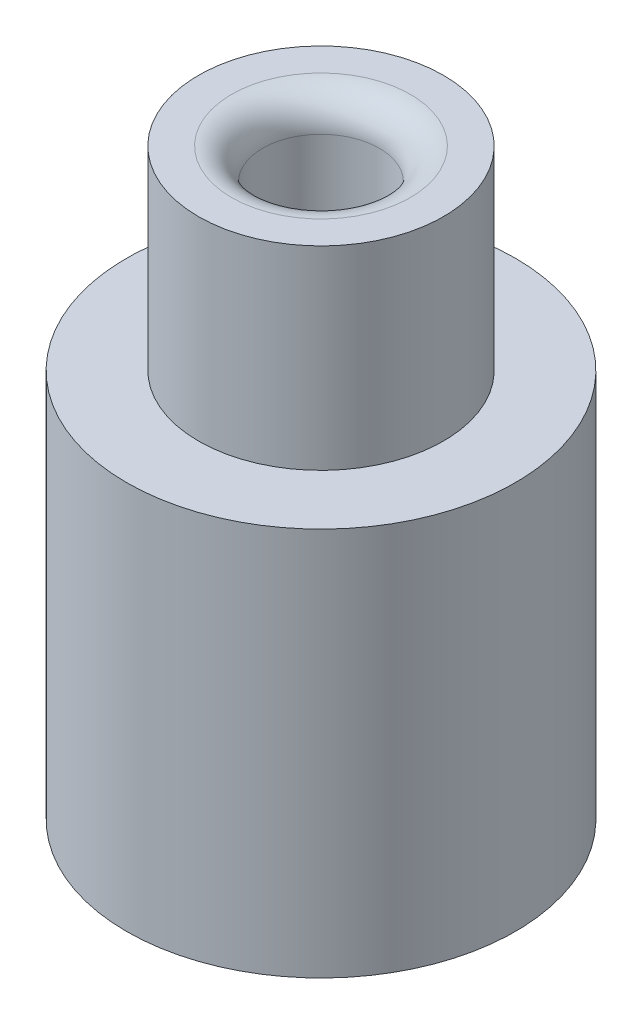
ISO-10303-21;
HEADER;
FILE_DESCRIPTION(('STEP AP214'),'2;1');
FILE_NAME('part.step','',(''),(''),'','','');
FILE_SCHEMA(('AUTOMOTIVE_DESIGN { 1 0 10303 214 1 1 1 1 }'));
ENDSEC;
DATA;
#1=APPLICATION_CONTEXT('core data for automotive mechanical design processes');
#2=APPLICATION_PROTOCOL_DEFINITION('international standard','automotive_design',2000,#1);
#3=PRODUCT_CONTEXT('',#1,'mechanical');
#4=PRODUCT('Part','Part','',(#3));
#5=PRODUCT_RELATED_PRODUCT_CATEGORY('part','',(#4));
#6=PRODUCT_DEFINITION_FORMATION('','',#4);
#7=PRODUCT_DEFINITION_CONTEXT('part definition',#1,'design');
#8=PRODUCT_DEFINITION('design','',#6,#7);
#9=PRODUCT_DEFINITION_SHAPE('','',#8);
#10=(LENGTH_UNIT() NAMED_UNIT(*) SI_UNIT(.MILLI.,.METRE.));
#11=(NAMED_UNIT(*) PLANE_ANGLE_UNIT() SI_UNIT($,.RADIAN.));
#12=(NAMED_UNIT(*) SI_UNIT($,.STERADIAN.) SOLID_ANGLE_UNIT());
#13=UNCERTAINTY_MEASURE_WITH_UNIT(LENGTH_MEASURE(1.E-05),#10,'distance_accuracy_value','');
#14=(GEOMETRIC_REPRESENTATION_CONTEXT(3) GLOBAL_UNCERTAINTY_ASSIGNED_CONTEXT((#13)) GLOBAL_UNIT_ASSIGNED_CONTEXT((#10,
#11,#12)) REPRESENTATION_CONTEXT('',''));
#15=CARTESIAN_POINT('',(0.,0.,0.));
#16=DIRECTION('',(0.,0.,1.));
#17=DIRECTION('',(1.,0.,0.));
#18=AXIS2_PLACEMENT_3D('',#15,#16,#17);
#19=CARTESIAN_POINT('',(0.,-4.,0.));
#20=DIRECTION('',(0.,1.,0.));
#21=DIRECTION('',(0.,0.,1.));
#22=AXIS2_PLACEMENT_3D('',#19,#20,#21);
#23=CYLINDRICAL_SURFACE('',#22,5.);
#24=CARTESIAN_POINT('',(0.,-4.,0.));
#25=DIRECTION('',(0.,1.,0.));
#26=DIRECTION('',(0.,0.,1.));
#27=AXIS2_PLACEMENT_3D('',#24,#25,#26);
#28=CIRCLE('',#27,5.);
#29=CARTESIAN_POINT('',(0.,-4.,5.));
#30=VERTEX_POINT('',#29);
#31=EDGE_CURVE('E46',#30,#30,#28,.T.);
#32=ORIENTED_EDGE('',*,*,#31,.T.);
#33=EDGE_LOOP('',(#32));
#34=FACE_BOUND('',#33,.T.);
#35=CARTESIAN_POINT('',(0.,6.,0.));
#36=DIRECTION('',(0.,1.,0.));
#37=DIRECTION('',(0.,0.,1.));
#38=AXIS2_PLACEMENT_3D('',#35,#36,#37);
#39=CIRCLE('',#38,5.);
#40=CARTESIAN_POINT('',(0.,6.,5.));
#41=VERTEX_POINT('',#40);
#42=EDGE_CURVE('E51',#41,#41,#39,.T.);
#43=ORIENTED_EDGE('',*,*,#42,.F.);
#44=EDGE_LOOP('',(#43));
#45=FACE_BOUND('',#44,.T.);
#46=ADVANCED_FACE('F31',(#34,#45),#23,.T.);
#47=CARTESIAN_POINT('',(0.,-4.,0.));
#48=DIRECTION('',(0.,1.,0.));
#49=DIRECTION('',(0.,0.,1.));
#50=AXIS2_PLACEMENT_3D('',#47,#48,#49);
#51=PLANE('',#50);
#52=CARTESIAN_POINT('',(0.,-4.,0.));
#53=DIRECTION('',(0.,-1.,0.));
#54=DIRECTION('',(0.,0.,-1.));
#55=AXIS2_PLACEMENT_3D('',#52,#53,#54);
#56=CIRCLE('',#55,2.25);
#57=CARTESIAN_POINT('',(0.,-4.,-2.25));
#58=VERTEX_POINT('',#57);
#59=EDGE_CURVE('E61',#58,#58,#56,.T.);
#60=ORIENTED_EDGE('',*,*,#59,.F.);
#61=EDGE_LOOP('',(#60));
#62=FACE_BOUND('',#61,.T.);
#63=ORIENTED_EDGE('',*,*,#31,.F.);
#64=EDGE_LOOP('',(#63));
#65=FACE_BOUND('',#64,.T.);
#66=ADVANCED_FACE('F76',(#62,#65),#51,.F.);
#67=CARTESIAN_POINT('',(0.,6.,0.));
#68=DIRECTION('',(0.,1.,0.));
#69=DIRECTION('',(0.,0.,1.));
#70=AXIS2_PLACEMENT_3D('',#67,#68,#69);
#71=PLANE('',#70);
#72=CARTESIAN_POINT('',(0.,6.,0.));
#73=DIRECTION('',(0.,1.,0.));
#74=DIRECTION('',(0.,0.,1.));
#75=AXIS2_PLACEMENT_3D('',#72,#73,#74);
#76=CIRCLE('',#75,3.15);
#77=CARTESIAN_POINT('',(0.,6.,3.15));
#78=VERTEX_POINT('',#77);
#79=EDGE_CURVE('E42',#78,#78,#76,.T.);
#80=ORIENTED_EDGE('',*,*,#79,.F.);
#81=EDGE_LOOP('',(#80));
#82=FACE_BOUND('',#81,.T.);
#83=ORIENTED_EDGE('',*,*,#42,.T.);
#84=EDGE_LOOP('',(#83));
#85=FACE_BOUND('',#84,.T.);
#86=ADVANCED_FACE('F79',(#82,#85),#71,.T.);
#87=CARTESIAN_POINT('',(0.,5.,0.));
#88=DIRECTION('',(0.,1.,0.));
#89=DIRECTION('',(0.,0.,1.));
#90=AXIS2_PLACEMENT_3D('',#87,#88,#89);
#91=CYLINDRICAL_SURFACE('',#90,3.15);
#92=ORIENTED_EDGE('',*,*,#79,.T.);
#93=EDGE_LOOP('',(#92));
#94=FACE_BOUND('',#93,.T.);
#95=CARTESIAN_POINT('',(0.,11.,0.));
#96=DIRECTION('',(0.,1.,0.));
#97=DIRECTION('',(0.,0.,1.));
#98=AXIS2_PLACEMENT_3D('',#95,#96,#97);
#99=CIRCLE('',#98,3.15);
#100=CARTESIAN_POINT('',(0.,11.,3.15));
#101=VERTEX_POINT('',#100);
#102=EDGE_CURVE('E54',#101,#101,#99,.T.);
#103=ORIENTED_EDGE('',*,*,#102,.F.);
#104=EDGE_LOOP('',(#103));
#105=FACE_BOUND('',#104,.T.);
#106=ADVANCED_FACE('F88',(#94,#105),#91,.T.);
#107=CARTESIAN_POINT('',(0.,11.,0.));
#108=DIRECTION('',(0.,1.,0.));
#109=DIRECTION('',(0.,0.,1.));
#110=AXIS2_PLACEMENT_3D('',#107,#108,#109);
#111=PLANE('',#110);
#112=CARTESIAN_POINT('',(0.,11.,0.));
#113=DIRECTION('',(0.,1.,0.));
#114=DIRECTION('',(0.,0.,1.));
#115=AXIS2_PLACEMENT_3D('',#112,#113,#114);
#116=CIRCLE('',#115,2.3);
#117=CARTESIAN_POINT('',(0.,11.,2.3));
#118=VERTEX_POINT('',#117);
#119=EDGE_CURVE('E10',#118,#118,#116,.F.);
#120=ORIENTED_EDGE('',*,*,#119,.T.);
#121=EDGE_LOOP('',(#120));
#122=FACE_BOUND('',#121,.T.);
#123=ORIENTED_EDGE('',*,*,#102,.T.);
#124=EDGE_LOOP('',(#123));
#125=FACE_BOUND('',#124,.T.);
#126=ADVANCED_FACE('F94',(#122,#125),#111,.T.);
#127=CARTESIAN_POINT('',(0.,0.999999999999999,0.));
#128=DIRECTION('',(0.,1.,0.));
#129=DIRECTION('',(0.,0.,1.));
#130=AXIS2_PLACEMENT_3D('',#127,#128,#129);
#131=CYLINDRICAL_SURFACE('',#130,1.5);
#132=CARTESIAN_POINT('',(0.,10.2,0.));
#133=DIRECTION('',(0.,1.,0.));
#134=DIRECTION('',(0.,0.,1.));
#135=AXIS2_PLACEMENT_3D('',#132,#133,#134);
#136=CIRCLE('',#135,1.5);
#137=CARTESIAN_POINT('',(0.,10.2,1.5));
#138=VERTEX_POINT('',#137);
#139=EDGE_CURVE('E38',#138,#138,#136,.T.);
#140=ORIENTED_EDGE('',*,*,#139,.T.);
#141=EDGE_LOOP('',(#140));
#142=FACE_BOUND('',#141,.T.);
#143=CARTESIAN_POINT('',(0.,1.,0.));
#144=DIRECTION('',(0.,-1.,0.));
#145=DIRECTION('',(0.,0.,-1.));
#146=AXIS2_PLACEMENT_3D('',#143,#144,#145);
#147=CIRCLE('',#146,1.5);
#148=CARTESIAN_POINT('',(0.,1.,-1.5));
#149=VERTEX_POINT('',#148);
#150=EDGE_CURVE('E57',#149,#149,#147,.F.);
#151=ORIENTED_EDGE('',*,*,#150,.F.);
#152=EDGE_LOOP('',(#151));
#153=FACE_BOUND('',#152,.T.);
#154=ADVANCED_FACE('F101',(#142,#153),#131,.F.);
#155=CARTESIAN_POINT('',(0.,1.,0.));
#156=DIRECTION('',(0.,-1.,0.));
#157=DIRECTION('',(0.,0.,-1.));
#158=AXIS2_PLACEMENT_3D('',#155,#156,#157);
#159=PLANE('',#158);
#160=CARTESIAN_POINT('',(0.,1.,0.));
#161=DIRECTION('',(0.,-1.,0.));
#162=DIRECTION('',(0.,0.,-1.));
#163=AXIS2_PLACEMENT_3D('',#160,#161,#162);
#164=CIRCLE('',#163,2.25);
#165=CARTESIAN_POINT('',(0.,1.,-2.25));
#166=VERTEX_POINT('',#165);
#167=EDGE_CURVE('E60',#166,#166,#164,.T.);
#168=ORIENTED_EDGE('',*,*,#167,.T.);
#169=EDGE_LOOP('',(#168));
#170=FACE_BOUND('',#169,.T.);
#171=ORIENTED_EDGE('',*,*,#150,.T.);
#172=EDGE_LOOP('',(#171));
#173=FACE_BOUND('',#172,.T.);
#174=ADVANCED_FACE('F67',(#170,#173),#159,.T.);
#175=CARTESIAN_POINT('',(0.,1.,0.));
#176=DIRECTION('',(0.,-1.,0.));
#177=DIRECTION('',(0.,0.,-1.));
#178=AXIS2_PLACEMENT_3D('',#175,#176,#177);
#179=CYLINDRICAL_SURFACE('',#178,2.25);
#180=ORIENTED_EDGE('',*,*,#167,.F.);
#181=EDGE_LOOP('',(#180));
#182=FACE_BOUND('',#181,.T.);
#183=ORIENTED_EDGE('',*,*,#59,.T.);
#184=EDGE_LOOP('',(#183));
#185=FACE_BOUND('',#184,.T.);
#186=ADVANCED_FACE('F70',(#182,#185),#179,.F.);
#187=CARTESIAN_POINT('',(0.,10.2,0.));
#188=DIRECTION('',(0.,1.,0.));
#189=DIRECTION('',(0.,0.,1.));
#190=AXIS2_PLACEMENT_3D('',#187,#188,#189);
#191=TOROIDAL_SURFACE('',#190,2.3,0.8);
#192=ORIENTED_EDGE('',*,*,#119,.F.);
#193=EDGE_LOOP('',(#192));
#194=FACE_BOUND('',#193,.T.);
#195=ORIENTED_EDGE('',*,*,#139,.F.);
#196=EDGE_LOOP('',(#195));
#197=FACE_BOUND('',#196,.T.);
#198=ADVANCED_FACE('F33',(#194,#197),#191,.T.);
#199=CLOSED_SHELL('',(#46,#66,#86,#106,#126,#154,#174,#186,#198));
#200=MANIFOLD_SOLID_BREP('B2',#199);
#201=ADVANCED_BREP_SHAPE_REPRESENTATION('',(#18,#200),#14);
#202=SHAPE_DEFINITION_REPRESENTATION(#9,#201);
ENDSEC;
END-ISO-10303-21;
